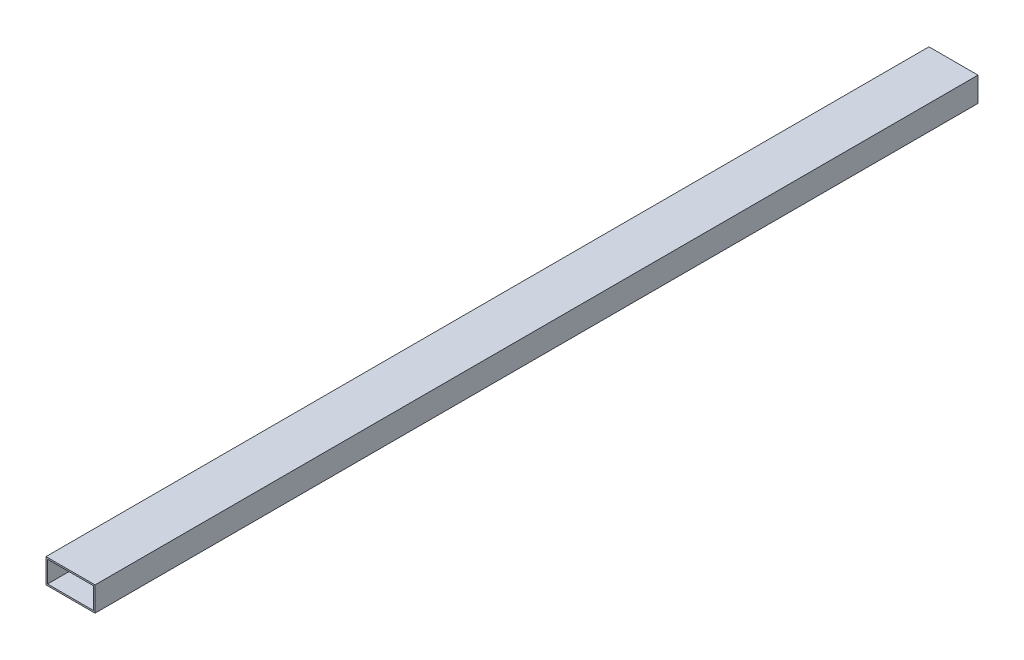
ISO-10303-21;
HEADER;
FILE_DESCRIPTION(('STEP AP214'),'2;1');
FILE_NAME('part.step','',(''),(''),'','','');
FILE_SCHEMA(('AUTOMOTIVE_DESIGN { 1 0 10303 214 1 1 1 1 }'));
ENDSEC;
DATA;
#1=APPLICATION_CONTEXT('core data for automotive mechanical design processes');
#2=APPLICATION_PROTOCOL_DEFINITION('international standard','automotive_design',2000,#1);
#3=PRODUCT_CONTEXT('',#1,'mechanical');
#4=PRODUCT('Part','Part','',(#3));
#5=PRODUCT_RELATED_PRODUCT_CATEGORY('part','',(#4));
#6=PRODUCT_DEFINITION_FORMATION('','',#4);
#7=PRODUCT_DEFINITION_CONTEXT('part definition',#1,'design');
#8=PRODUCT_DEFINITION('design','',#6,#7);
#9=PRODUCT_DEFINITION_SHAPE('','',#8);
#10=(LENGTH_UNIT() NAMED_UNIT(*) SI_UNIT(.MILLI.,.METRE.));
#11=(NAMED_UNIT(*) PLANE_ANGLE_UNIT() SI_UNIT($,.RADIAN.));
#12=(NAMED_UNIT(*) SI_UNIT($,.STERADIAN.) SOLID_ANGLE_UNIT());
#13=UNCERTAINTY_MEASURE_WITH_UNIT(LENGTH_MEASURE(1.E-05),#10,'distance_accuracy_value','');
#14=(GEOMETRIC_REPRESENTATION_CONTEXT(3) GLOBAL_UNCERTAINTY_ASSIGNED_CONTEXT((#13)) GLOBAL_UNIT_ASSIGNED_CONTEXT((#10,
#11,#12)) REPRESENTATION_CONTEXT('',''));
#15=CARTESIAN_POINT('',(0.,0.,0.));
#16=DIRECTION('',(0.,0.,1.));
#17=DIRECTION('',(1.,0.,0.));
#18=AXIS2_PLACEMENT_3D('',#15,#16,#17);
#19=CARTESIAN_POINT('',(0.,0.,457.2));
#20=DIRECTION('',(0.,0.,1.));
#21=DIRECTION('',(1.,0.,0.));
#22=AXIS2_PLACEMENT_3D('',#19,#20,#21);
#23=PLANE('',#22);
#24=DIRECTION('',(0.,-1.,0.));
#25=VECTOR('',#24,1.);
#26=CARTESIAN_POINT('',(-25.4,12.7,457.2));
#27=LINE('',#26,#25);
#28=CARTESIAN_POINT('',(-25.4,12.7,457.2));
#29=VERTEX_POINT('',#28);
#30=CARTESIAN_POINT('',(-25.4,-12.7,457.2));
#31=VERTEX_POINT('',#30);
#32=EDGE_CURVE('E119',#29,#31,#27,.T.);
#33=ORIENTED_EDGE('',*,*,#32,.T.);
#34=DIRECTION('',(1.,0.,0.));
#35=VECTOR('',#34,1.);
#36=CARTESIAN_POINT('',(-25.4,-12.7,457.2));
#37=LINE('',#36,#35);
#38=CARTESIAN_POINT('',(25.4,-12.7,457.2));
#39=VERTEX_POINT('',#38);
#40=EDGE_CURVE('E178',#31,#39,#37,.T.);
#41=ORIENTED_EDGE('',*,*,#40,.T.);
#42=DIRECTION('',(0.,1.,0.));
#43=VECTOR('',#42,1.);
#44=CARTESIAN_POINT('',(25.4,-12.7,457.2));
#45=LINE('',#44,#43);
#46=CARTESIAN_POINT('',(25.4,12.7,457.2));
#47=VERTEX_POINT('',#46);
#48=EDGE_CURVE('E181',#39,#47,#45,.T.);
#49=ORIENTED_EDGE('',*,*,#48,.T.);
#50=DIRECTION('',(-1.,0.,0.));
#51=VECTOR('',#50,1.);
#52=CARTESIAN_POINT('',(25.4,12.7,457.2));
#53=LINE('',#52,#51);
#54=EDGE_CURVE('E65',#47,#29,#53,.T.);
#55=ORIENTED_EDGE('',*,*,#54,.T.);
#56=EDGE_LOOP('',(#33,#41,#49,#55));
#57=FACE_BOUND('',#56,.T.);
#58=DIRECTION('',(1.,0.,0.));
#59=VECTOR('',#58,1.);
#60=CARTESIAN_POINT('',(-23.8125,-11.1125,457.2));
#61=LINE('',#60,#59);
#62=CARTESIAN_POINT('',(-23.8125,-11.1125,457.2));
#63=VERTEX_POINT('',#62);
#64=CARTESIAN_POINT('',(23.8125,-11.1125,457.2));
#65=VERTEX_POINT('',#64);
#66=EDGE_CURVE('E160',#63,#65,#61,.T.);
#67=ORIENTED_EDGE('',*,*,#66,.F.);
#68=DIRECTION('',(0.,-1.,0.));
#69=VECTOR('',#68,1.);
#70=CARTESIAN_POINT('',(-23.8125,11.1125,457.2));
#71=LINE('',#70,#69);
#72=CARTESIAN_POINT('',(-23.8125,11.1125,457.2));
#73=VERTEX_POINT('',#72);
#74=EDGE_CURVE('E115',#73,#63,#71,.T.);
#75=ORIENTED_EDGE('',*,*,#74,.F.);
#76=DIRECTION('',(-1.,0.,0.));
#77=VECTOR('',#76,1.);
#78=CARTESIAN_POINT('',(23.8125,11.1125,457.2));
#79=LINE('',#78,#77);
#80=CARTESIAN_POINT('',(23.8125,11.1125,457.2));
#81=VERTEX_POINT('',#80);
#82=EDGE_CURVE('E166',#81,#73,#79,.T.);
#83=ORIENTED_EDGE('',*,*,#82,.F.);
#84=DIRECTION('',(0.,1.,0.));
#85=VECTOR('',#84,1.);
#86=CARTESIAN_POINT('',(23.8125,-11.1125,457.2));
#87=LINE('',#86,#85);
#88=EDGE_CURVE('E163',#65,#81,#87,.T.);
#89=ORIENTED_EDGE('',*,*,#88,.F.);
#90=EDGE_LOOP('',(#67,#75,#83,#89));
#91=FACE_BOUND('',#90,.T.);
#92=ADVANCED_FACE('F41',(#57,#91),#23,.T.);
#93=CARTESIAN_POINT('',(-25.4,12.7,457.2));
#94=DIRECTION('',(1.,0.,0.));
#95=DIRECTION('',(0.,0.,-1.));
#96=AXIS2_PLACEMENT_3D('',#93,#94,#95);
#97=PLANE('',#96);
#98=DIRECTION('',(0.,0.,-1.));
#99=VECTOR('',#98,1.);
#100=CARTESIAN_POINT('',(-25.4,12.7,457.2));
#101=LINE('',#100,#99);
#102=CARTESIAN_POINT('',(-25.4,12.7,-457.2));
#103=VERTEX_POINT('',#102);
#104=EDGE_CURVE('E186',#29,#103,#101,.T.);
#105=ORIENTED_EDGE('',*,*,#104,.T.);
#106=DIRECTION('',(0.,-1.,0.));
#107=VECTOR('',#106,1.);
#108=CARTESIAN_POINT('',(-25.4,12.7,-457.2));
#109=LINE('',#108,#107);
#110=CARTESIAN_POINT('',(-25.4,-12.7,-457.2));
#111=VERTEX_POINT('',#110);
#112=EDGE_CURVE('E142',#103,#111,#109,.T.);
#113=ORIENTED_EDGE('',*,*,#112,.T.);
#114=DIRECTION('',(0.,0.,-1.));
#115=VECTOR('',#114,1.);
#116=CARTESIAN_POINT('',(-25.4,-12.7,457.2));
#117=LINE('',#116,#115);
#118=EDGE_CURVE('E11',#31,#111,#117,.T.);
#119=ORIENTED_EDGE('',*,*,#118,.F.);
#120=ORIENTED_EDGE('',*,*,#32,.F.);
#121=EDGE_LOOP('',(#105,#113,#119,#120));
#122=FACE_BOUND('',#121,.T.);
#123=ADVANCED_FACE('F43',(#122),#97,.F.);
#124=CARTESIAN_POINT('',(-25.4,-12.7,457.2));
#125=DIRECTION('',(0.,1.,0.));
#126=DIRECTION('',(-1.,0.,0.));
#127=AXIS2_PLACEMENT_3D('',#124,#125,#126);
#128=PLANE('',#127);
#129=ORIENTED_EDGE('',*,*,#118,.T.);
#130=DIRECTION('',(1.,0.,0.));
#131=VECTOR('',#130,1.);
#132=CARTESIAN_POINT('',(-25.4,-12.7,-457.2));
#133=LINE('',#132,#131);
#134=CARTESIAN_POINT('',(25.4,-12.7,-457.2));
#135=VERTEX_POINT('',#134);
#136=EDGE_CURVE('E146',#111,#135,#133,.T.);
#137=ORIENTED_EDGE('',*,*,#136,.T.);
#138=DIRECTION('',(0.,0.,-1.));
#139=VECTOR('',#138,1.);
#140=CARTESIAN_POINT('',(25.4,-12.7,457.2));
#141=LINE('',#140,#139);
#142=EDGE_CURVE('E50',#39,#135,#141,.T.);
#143=ORIENTED_EDGE('',*,*,#142,.F.);
#144=ORIENTED_EDGE('',*,*,#40,.F.);
#145=EDGE_LOOP('',(#129,#137,#143,#144));
#146=FACE_BOUND('',#145,.T.);
#147=ADVANCED_FACE('F202',(#146),#128,.F.);
#148=CARTESIAN_POINT('',(25.4,-12.7,457.2));
#149=DIRECTION('',(-1.,0.,0.));
#150=DIRECTION('',(0.,0.,1.));
#151=AXIS2_PLACEMENT_3D('',#148,#149,#150);
#152=PLANE('',#151);
#153=ORIENTED_EDGE('',*,*,#142,.T.);
#154=DIRECTION('',(0.,1.,0.));
#155=VECTOR('',#154,1.);
#156=CARTESIAN_POINT('',(25.4,-12.7,-457.2));
#157=LINE('',#156,#155);
#158=CARTESIAN_POINT('',(25.4,12.7,-457.2));
#159=VERTEX_POINT('',#158);
#160=EDGE_CURVE('E150',#135,#159,#157,.T.);
#161=ORIENTED_EDGE('',*,*,#160,.T.);
#162=DIRECTION('',(0.,0.,-1.));
#163=VECTOR('',#162,1.);
#164=CARTESIAN_POINT('',(25.4,12.7,457.2));
#165=LINE('',#164,#163);
#166=EDGE_CURVE('E189',#47,#159,#165,.T.);
#167=ORIENTED_EDGE('',*,*,#166,.F.);
#168=ORIENTED_EDGE('',*,*,#48,.F.);
#169=EDGE_LOOP('',(#153,#161,#167,#168));
#170=FACE_BOUND('',#169,.T.);
#171=ADVANCED_FACE('F196',(#170),#152,.F.);
#172=CARTESIAN_POINT('',(25.4,12.7,457.2));
#173=DIRECTION('',(0.,-1.,0.));
#174=DIRECTION('',(1.,0.,0.));
#175=AXIS2_PLACEMENT_3D('',#172,#173,#174);
#176=PLANE('',#175);
#177=ORIENTED_EDGE('',*,*,#166,.T.);
#178=DIRECTION('',(-1.,0.,0.));
#179=VECTOR('',#178,1.);
#180=CARTESIAN_POINT('',(25.4,12.7,-457.2));
#181=LINE('',#180,#179);
#182=EDGE_CURVE('E154',#159,#103,#181,.T.);
#183=ORIENTED_EDGE('',*,*,#182,.T.);
#184=ORIENTED_EDGE('',*,*,#104,.F.);
#185=ORIENTED_EDGE('',*,*,#54,.F.);
#186=EDGE_LOOP('',(#177,#183,#184,#185));
#187=FACE_BOUND('',#186,.T.);
#188=ADVANCED_FACE('F207',(#187),#176,.F.);
#189=CARTESIAN_POINT('',(-23.8125,11.1125,457.2));
#190=DIRECTION('',(1.,0.,0.));
#191=DIRECTION('',(0.,1.,0.));
#192=AXIS2_PLACEMENT_3D('',#189,#190,#191);
#193=PLANE('',#192);
#194=DIRECTION('',(0.,0.,-1.));
#195=VECTOR('',#194,1.);
#196=CARTESIAN_POINT('',(-23.8125,-11.1125,457.2));
#197=LINE('',#196,#195);
#198=CARTESIAN_POINT('',(-23.8125,-11.1125,-457.2));
#199=VERTEX_POINT('',#198);
#200=EDGE_CURVE('E107',#63,#199,#197,.T.);
#201=ORIENTED_EDGE('',*,*,#200,.T.);
#202=DIRECTION('',(0.,-1.,0.));
#203=VECTOR('',#202,1.);
#204=CARTESIAN_POINT('',(-23.8125,11.1125,-457.2));
#205=LINE('',#204,#203);
#206=CARTESIAN_POINT('',(-23.8125,11.1125,-457.2));
#207=VERTEX_POINT('',#206);
#208=EDGE_CURVE('E112',#207,#199,#205,.T.);
#209=ORIENTED_EDGE('',*,*,#208,.F.);
#210=DIRECTION('',(0.,0.,-1.));
#211=VECTOR('',#210,1.);
#212=CARTESIAN_POINT('',(-23.8125,11.1125,457.2));
#213=LINE('',#212,#211);
#214=EDGE_CURVE('E169',#73,#207,#213,.T.);
#215=ORIENTED_EDGE('',*,*,#214,.F.);
#216=ORIENTED_EDGE('',*,*,#74,.T.);
#217=EDGE_LOOP('',(#201,#209,#215,#216));
#218=FACE_BOUND('',#217,.T.);
#219=ADVANCED_FACE('F109',(#218),#193,.T.);
#220=CARTESIAN_POINT('',(-23.8125,-11.1125,457.2));
#221=DIRECTION('',(0.,1.,0.));
#222=DIRECTION('',(0.,0.,1.));
#223=AXIS2_PLACEMENT_3D('',#220,#221,#222);
#224=PLANE('',#223);
#225=DIRECTION('',(0.,0.,-1.));
#226=VECTOR('',#225,1.);
#227=CARTESIAN_POINT('',(23.8125,-11.1125,457.2));
#228=LINE('',#227,#226);
#229=CARTESIAN_POINT('',(23.8125,-11.1125,-457.2));
#230=VERTEX_POINT('',#229);
#231=EDGE_CURVE('E120',#65,#230,#228,.T.);
#232=ORIENTED_EDGE('',*,*,#231,.T.);
#233=DIRECTION('',(1.,0.,0.));
#234=VECTOR('',#233,1.);
#235=CARTESIAN_POINT('',(-23.8125,-11.1125,-457.2));
#236=LINE('',#235,#234);
#237=EDGE_CURVE('E123',#199,#230,#236,.T.);
#238=ORIENTED_EDGE('',*,*,#237,.F.);
#239=ORIENTED_EDGE('',*,*,#200,.F.);
#240=ORIENTED_EDGE('',*,*,#66,.T.);
#241=EDGE_LOOP('',(#232,#238,#239,#240));
#242=FACE_BOUND('',#241,.T.);
#243=ADVANCED_FACE('F124',(#242),#224,.T.);
#244=CARTESIAN_POINT('',(23.8125,-11.1125,457.2));
#245=DIRECTION('',(-1.,0.,0.));
#246=DIRECTION('',(0.,0.,1.));
#247=AXIS2_PLACEMENT_3D('',#244,#245,#246);
#248=PLANE('',#247);
#249=DIRECTION('',(0.,0.,-1.));
#250=VECTOR('',#249,1.);
#251=CARTESIAN_POINT('',(23.8125,11.1125,457.2));
#252=LINE('',#251,#250);
#253=CARTESIAN_POINT('',(23.8125,11.1125,-457.2));
#254=VERTEX_POINT('',#253);
#255=EDGE_CURVE('E57',#81,#254,#252,.T.);
#256=ORIENTED_EDGE('',*,*,#255,.T.);
#257=DIRECTION('',(0.,1.,0.));
#258=VECTOR('',#257,1.);
#259=CARTESIAN_POINT('',(23.8125,-11.1125,-457.2));
#260=LINE('',#259,#258);
#261=EDGE_CURVE('E130',#230,#254,#260,.T.);
#262=ORIENTED_EDGE('',*,*,#261,.F.);
#263=ORIENTED_EDGE('',*,*,#231,.F.);
#264=ORIENTED_EDGE('',*,*,#88,.T.);
#265=EDGE_LOOP('',(#256,#262,#263,#264));
#266=FACE_BOUND('',#265,.T.);
#267=ADVANCED_FACE('F225',(#266),#248,.T.);
#268=CARTESIAN_POINT('',(23.8125,11.1125,457.2));
#269=DIRECTION('',(0.,-1.,0.));
#270=DIRECTION('',(0.,0.,-1.));
#271=AXIS2_PLACEMENT_3D('',#268,#269,#270);
#272=PLANE('',#271);
#273=ORIENTED_EDGE('',*,*,#214,.T.);
#274=DIRECTION('',(-1.,0.,0.));
#275=VECTOR('',#274,1.);
#276=CARTESIAN_POINT('',(23.8125,11.1125,-457.2));
#277=LINE('',#276,#275);
#278=EDGE_CURVE('E134',#254,#207,#277,.T.);
#279=ORIENTED_EDGE('',*,*,#278,.F.);
#280=ORIENTED_EDGE('',*,*,#255,.F.);
#281=ORIENTED_EDGE('',*,*,#82,.T.);
#282=EDGE_LOOP('',(#273,#279,#280,#281));
#283=FACE_BOUND('',#282,.T.);
#284=ADVANCED_FACE('F228',(#283),#272,.T.);
#285=CARTESIAN_POINT('',(0.,0.,-457.2));
#286=DIRECTION('',(0.,0.,1.));
#287=DIRECTION('',(1.,0.,0.));
#288=AXIS2_PLACEMENT_3D('',#285,#286,#287);
#289=PLANE('',#288);
#290=ORIENTED_EDGE('',*,*,#278,.T.);
#291=ORIENTED_EDGE('',*,*,#208,.T.);
#292=ORIENTED_EDGE('',*,*,#237,.T.);
#293=ORIENTED_EDGE('',*,*,#261,.T.);
#294=EDGE_LOOP('',(#290,#291,#292,#293));
#295=FACE_BOUND('',#294,.T.);
#296=ORIENTED_EDGE('',*,*,#112,.F.);
#297=ORIENTED_EDGE('',*,*,#182,.F.);
#298=ORIENTED_EDGE('',*,*,#160,.F.);
#299=ORIENTED_EDGE('',*,*,#136,.F.);
#300=EDGE_LOOP('',(#296,#297,#298,#299));
#301=FACE_BOUND('',#300,.T.);
#302=ADVANCED_FACE('F132',(#295,#301),#289,.F.);
#303=CLOSED_SHELL('',(#92,#123,#147,#171,#188,#219,#243,#267,#284,#302));
#304=MANIFOLD_SOLID_BREP('B2',#303);
#305=ADVANCED_BREP_SHAPE_REPRESENTATION('',(#18,#304),#14);
#306=SHAPE_DEFINITION_REPRESENTATION(#9,#305);
ENDSEC;
END-ISO-10303-21;
